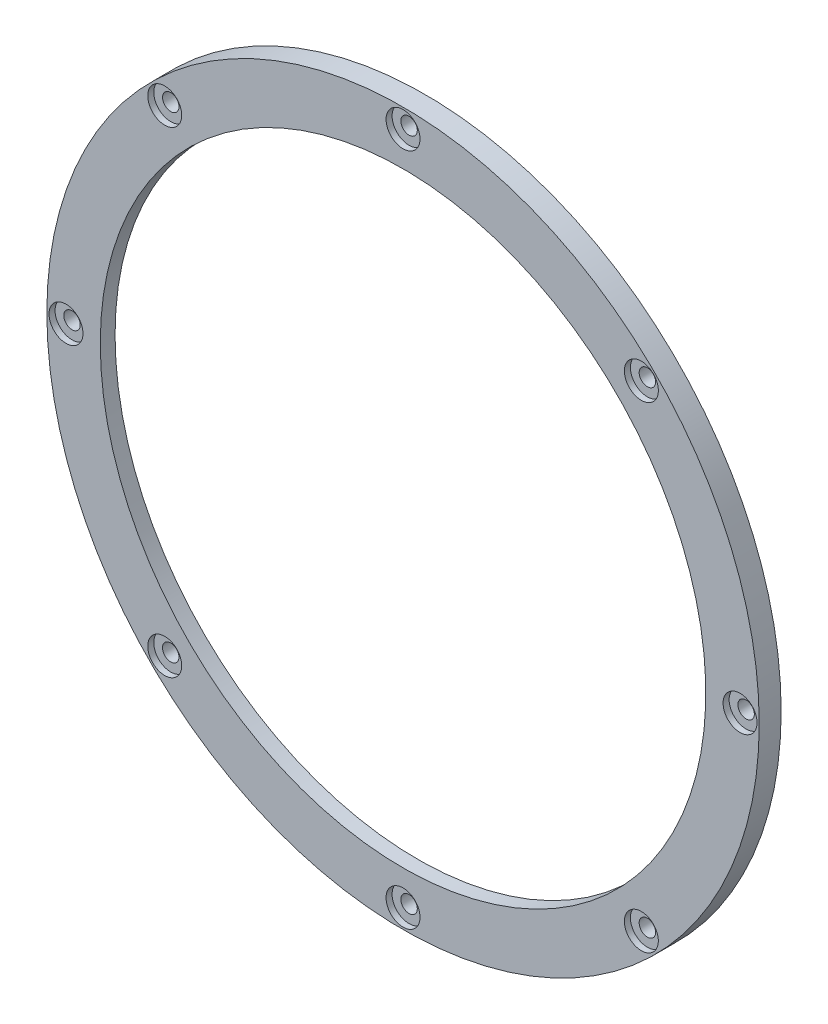
ISO-10303-21;
HEADER;
FILE_DESCRIPTION(('STEP AP214'),'2;1');
FILE_NAME('part.step','',(''),(''),'','','');
FILE_SCHEMA(('AUTOMOTIVE_DESIGN { 1 0 10303 214 1 1 1 1 }'));
ENDSEC;
DATA;
#1=APPLICATION_CONTEXT('core data for automotive mechanical design processes');
#2=APPLICATION_PROTOCOL_DEFINITION('international standard','automotive_design',2000,#1);
#3=PRODUCT_CONTEXT('',#1,'mechanical');
#4=PRODUCT('Part','Part','',(#3));
#5=PRODUCT_RELATED_PRODUCT_CATEGORY('part','',(#4));
#6=PRODUCT_DEFINITION_FORMATION('','',#4);
#7=PRODUCT_DEFINITION_CONTEXT('part definition',#1,'design');
#8=PRODUCT_DEFINITION('design','',#6,#7);
#9=PRODUCT_DEFINITION_SHAPE('','',#8);
#10=(LENGTH_UNIT() NAMED_UNIT(*) SI_UNIT(.MILLI.,.METRE.));
#11=(NAMED_UNIT(*) PLANE_ANGLE_UNIT() SI_UNIT($,.RADIAN.));
#12=(NAMED_UNIT(*) SI_UNIT($,.STERADIAN.) SOLID_ANGLE_UNIT());
#13=UNCERTAINTY_MEASURE_WITH_UNIT(LENGTH_MEASURE(1.E-05),#10,'distance_accuracy_value','');
#14=(GEOMETRIC_REPRESENTATION_CONTEXT(3) GLOBAL_UNCERTAINTY_ASSIGNED_CONTEXT((#13)) GLOBAL_UNIT_ASSIGNED_CONTEXT((#10,
#11,#12)) REPRESENTATION_CONTEXT('',''));
#15=CARTESIAN_POINT('',(0.,0.,0.));
#16=DIRECTION('',(0.,0.,1.));
#17=DIRECTION('',(1.,0.,0.));
#18=AXIS2_PLACEMENT_3D('',#15,#16,#17);
#19=CARTESIAN_POINT('',(61.5,2.14726102338853E-13,-1.3));
#20=DIRECTION('',(0.,0.,1.));
#21=DIRECTION('',(1.,0.,0.));
#22=AXIS2_PLACEMENT_3D('',#19,#20,#21);
#23=CYLINDRICAL_SURFACE('',#22,1.5);
#24=CARTESIAN_POINT('',(61.5,2.14726102338853E-13,-1.3));
#25=DIRECTION('',(0.,0.,1.));
#26=DIRECTION('',(1.,0.,0.));
#27=AXIS2_PLACEMENT_3D('',#24,#25,#26);
#28=CIRCLE('',#27,1.5);
#29=CARTESIAN_POINT('',(63.,2.14726102338853E-13,-1.3));
#30=VERTEX_POINT('',#29);
#31=EDGE_CURVE('E107',#30,#30,#28,.F.);
#32=ORIENTED_EDGE('',*,*,#31,.T.);
#33=EDGE_LOOP('',(#32));
#34=FACE_BOUND('',#33,.T.);
#35=CARTESIAN_POINT('',(61.5,2.14726102338853E-13,1.6));
#36=DIRECTION('',(0.,0.,1.));
#37=DIRECTION('',(1.,0.,0.));
#38=AXIS2_PLACEMENT_3D('',#35,#36,#37);
#39=CIRCLE('',#38,1.5);
#40=CARTESIAN_POINT('',(63.,2.14726102338853E-13,1.6));
#41=VERTEX_POINT('',#40);
#42=EDGE_CURVE('E122',#41,#41,#39,.F.);
#43=ORIENTED_EDGE('',*,*,#42,.F.);
#44=EDGE_LOOP('',(#43));
#45=FACE_BOUND('',#44,.T.);
#46=ADVANCED_FACE('F15',(#34,#45),#23,.F.);
#47=CARTESIAN_POINT('',(43.4870670429724,43.4870670429729,-1.3));
#48=DIRECTION('',(0.,0.,1.));
#49=DIRECTION('',(1.,0.,0.));
#50=AXIS2_PLACEMENT_3D('',#47,#48,#49);
#51=CYLINDRICAL_SURFACE('',#50,1.5);
#52=CARTESIAN_POINT('',(43.4870670429724,43.4870670429729,-1.3));
#53=DIRECTION('',(0.,0.,1.));
#54=DIRECTION('',(1.,0.,0.));
#55=AXIS2_PLACEMENT_3D('',#52,#53,#54);
#56=CIRCLE('',#55,1.5);
#57=CARTESIAN_POINT('',(44.9870670429724,43.4870670429729,-1.3));
#58=VERTEX_POINT('',#57);
#59=EDGE_CURVE('E104',#58,#58,#56,.F.);
#60=ORIENTED_EDGE('',*,*,#59,.T.);
#61=EDGE_LOOP('',(#60));
#62=FACE_BOUND('',#61,.T.);
#63=CARTESIAN_POINT('',(43.4870670429724,43.4870670429729,1.6));
#64=DIRECTION('',(0.,0.,1.));
#65=DIRECTION('',(1.,0.,0.));
#66=AXIS2_PLACEMENT_3D('',#63,#64,#65);
#67=CIRCLE('',#66,1.5);
#68=CARTESIAN_POINT('',(44.9870670429724,43.4870670429729,1.6));
#69=VERTEX_POINT('',#68);
#70=EDGE_CURVE('E119',#69,#69,#67,.F.);
#71=ORIENTED_EDGE('',*,*,#70,.F.);
#72=EDGE_LOOP('',(#71));
#73=FACE_BOUND('',#72,.T.);
#74=ADVANCED_FACE('F153',(#62,#73),#51,.F.);
#75=CARTESIAN_POINT('',(-43.4870670429731,43.4870670429723,-1.3));
#76=DIRECTION('',(0.,0.,1.));
#77=DIRECTION('',(1.,0.,0.));
#78=AXIS2_PLACEMENT_3D('',#75,#76,#77);
#79=CYLINDRICAL_SURFACE('',#78,1.5);
#80=CARTESIAN_POINT('',(-43.4870670429731,43.4870670429723,-1.3));
#81=DIRECTION('',(0.,0.,1.));
#82=DIRECTION('',(1.,0.,0.));
#83=AXIS2_PLACEMENT_3D('',#80,#81,#82);
#84=CIRCLE('',#83,1.5);
#85=CARTESIAN_POINT('',(-41.9870670429731,43.4870670429723,-1.3));
#86=VERTEX_POINT('',#85);
#87=EDGE_CURVE('E101',#86,#86,#84,.F.);
#88=ORIENTED_EDGE('',*,*,#87,.T.);
#89=EDGE_LOOP('',(#88));
#90=FACE_BOUND('',#89,.T.);
#91=CARTESIAN_POINT('',(-43.4870670429731,43.4870670429723,1.6));
#92=DIRECTION('',(0.,0.,1.));
#93=DIRECTION('',(1.,0.,0.));
#94=AXIS2_PLACEMENT_3D('',#91,#92,#93);
#95=CIRCLE('',#94,1.5);
#96=CARTESIAN_POINT('',(-41.9870670429731,43.4870670429723,1.6));
#97=VERTEX_POINT('',#96);
#98=EDGE_CURVE('E116',#97,#97,#95,.F.);
#99=ORIENTED_EDGE('',*,*,#98,.F.);
#100=EDGE_LOOP('',(#99));
#101=FACE_BOUND('',#100,.T.);
#102=ADVANCED_FACE('F142',(#90,#101),#79,.F.);
#103=CARTESIAN_POINT('',(-61.5,-6.44178307016558E-13,-1.3));
#104=DIRECTION('',(0.,0.,1.));
#105=DIRECTION('',(1.,0.,0.));
#106=AXIS2_PLACEMENT_3D('',#103,#104,#105);
#107=CYLINDRICAL_SURFACE('',#106,1.5);
#108=CARTESIAN_POINT('',(-61.5,-6.44178307016558E-13,-1.3));
#109=DIRECTION('',(0.,0.,1.));
#110=DIRECTION('',(1.,0.,0.));
#111=AXIS2_PLACEMENT_3D('',#108,#109,#110);
#112=CIRCLE('',#111,1.5);
#113=CARTESIAN_POINT('',(-60.,-6.44178307016558E-13,-1.3));
#114=VERTEX_POINT('',#113);
#115=EDGE_CURVE('E98',#114,#114,#112,.F.);
#116=ORIENTED_EDGE('',*,*,#115,.T.);
#117=EDGE_LOOP('',(#116));
#118=FACE_BOUND('',#117,.T.);
#119=CARTESIAN_POINT('',(-61.5,-6.44178307016558E-13,1.6));
#120=DIRECTION('',(0.,0.,1.));
#121=DIRECTION('',(1.,0.,0.));
#122=AXIS2_PLACEMENT_3D('',#119,#120,#121);
#123=CIRCLE('',#122,1.5);
#124=CARTESIAN_POINT('',(-60.,-6.44178307016558E-13,1.6));
#125=VERTEX_POINT('',#124);
#126=EDGE_CURVE('E18',#125,#125,#123,.F.);
#127=ORIENTED_EDGE('',*,*,#126,.F.);
#128=EDGE_LOOP('',(#127));
#129=FACE_BOUND('',#128,.T.);
#130=ADVANCED_FACE('F139',(#118,#129),#107,.F.);
#131=CARTESIAN_POINT('',(-43.4870670429721,-43.4870670429732,-1.3));
#132=DIRECTION('',(0.,0.,1.));
#133=DIRECTION('',(1.,0.,0.));
#134=AXIS2_PLACEMENT_3D('',#131,#132,#133);
#135=CYLINDRICAL_SURFACE('',#134,1.5);
#136=CARTESIAN_POINT('',(-43.4870670429721,-43.4870670429732,-1.3));
#137=DIRECTION('',(0.,0.,1.));
#138=DIRECTION('',(1.,0.,0.));
#139=AXIS2_PLACEMENT_3D('',#136,#137,#138);
#140=CIRCLE('',#139,1.5);
#141=CARTESIAN_POINT('',(-41.9870670429721,-43.4870670429732,-1.3));
#142=VERTEX_POINT('',#141);
#143=EDGE_CURVE('E95',#142,#142,#140,.F.);
#144=ORIENTED_EDGE('',*,*,#143,.T.);
#145=EDGE_LOOP('',(#144));
#146=FACE_BOUND('',#145,.T.);
#147=CARTESIAN_POINT('',(-43.4870670429721,-43.4870670429732,1.6));
#148=DIRECTION('',(0.,0.,1.));
#149=DIRECTION('',(1.,0.,0.));
#150=AXIS2_PLACEMENT_3D('',#147,#148,#149);
#151=CIRCLE('',#150,1.5);
#152=CARTESIAN_POINT('',(-41.9870670429721,-43.4870670429732,1.6));
#153=VERTEX_POINT('',#152);
#154=EDGE_CURVE('E130',#153,#153,#151,.F.);
#155=ORIENTED_EDGE('',*,*,#154,.F.);
#156=EDGE_LOOP('',(#155));
#157=FACE_BOUND('',#156,.T.);
#158=ADVANCED_FACE('F141',(#146,#157),#135,.F.);
#159=CARTESIAN_POINT('',(43.4870670429727,-43.4870670429726,-1.3));
#160=DIRECTION('',(0.,0.,1.));
#161=DIRECTION('',(1.,0.,0.));
#162=AXIS2_PLACEMENT_3D('',#159,#160,#161);
#163=CYLINDRICAL_SURFACE('',#162,1.5);
#164=CARTESIAN_POINT('',(43.4870670429727,-43.4870670429726,-1.3));
#165=DIRECTION('',(0.,0.,1.));
#166=DIRECTION('',(1.,0.,0.));
#167=AXIS2_PLACEMENT_3D('',#164,#165,#166);
#168=CIRCLE('',#167,1.5);
#169=CARTESIAN_POINT('',(44.9870670429727,-43.4870670429726,-1.3));
#170=VERTEX_POINT('',#169);
#171=EDGE_CURVE('E92',#170,#170,#168,.F.);
#172=ORIENTED_EDGE('',*,*,#171,.T.);
#173=EDGE_LOOP('',(#172));
#174=FACE_BOUND('',#173,.T.);
#175=CARTESIAN_POINT('',(43.4870670429727,-43.4870670429726,1.6));
#176=DIRECTION('',(0.,0.,1.));
#177=DIRECTION('',(1.,0.,0.));
#178=AXIS2_PLACEMENT_3D('',#175,#176,#177);
#179=CIRCLE('',#178,1.5);
#180=CARTESIAN_POINT('',(44.9870670429727,-43.4870670429726,1.6));
#181=VERTEX_POINT('',#180);
#182=EDGE_CURVE('E125',#181,#181,#179,.F.);
#183=ORIENTED_EDGE('',*,*,#182,.F.);
#184=EDGE_LOOP('',(#183));
#185=FACE_BOUND('',#184,.T.);
#186=ADVANCED_FACE('F150',(#174,#185),#163,.F.);
#187=CARTESIAN_POINT('',(0.,-61.5,-1.3));
#188=DIRECTION('',(0.,0.,1.));
#189=DIRECTION('',(1.,0.,0.));
#190=AXIS2_PLACEMENT_3D('',#187,#188,#189);
#191=CYLINDRICAL_SURFACE('',#190,1.5);
#192=CARTESIAN_POINT('',(0.,-61.5,-1.3));
#193=DIRECTION('',(0.,0.,1.));
#194=DIRECTION('',(1.,0.,0.));
#195=AXIS2_PLACEMENT_3D('',#192,#193,#194);
#196=CIRCLE('',#195,1.5);
#197=CARTESIAN_POINT('',(1.5,-61.5,-1.3));
#198=VERTEX_POINT('',#197);
#199=EDGE_CURVE('E89',#198,#198,#196,.F.);
#200=ORIENTED_EDGE('',*,*,#199,.T.);
#201=EDGE_LOOP('',(#200));
#202=FACE_BOUND('',#201,.T.);
#203=CARTESIAN_POINT('',(0.,-61.5,1.6));
#204=DIRECTION('',(0.,0.,1.));
#205=DIRECTION('',(1.,0.,0.));
#206=AXIS2_PLACEMENT_3D('',#203,#204,#205);
#207=CIRCLE('',#206,1.5);
#208=CARTESIAN_POINT('',(1.5,-61.5,1.6));
#209=VERTEX_POINT('',#208);
#210=EDGE_CURVE('E128',#209,#209,#207,.F.);
#211=ORIENTED_EDGE('',*,*,#210,.F.);
#212=EDGE_LOOP('',(#211));
#213=FACE_BOUND('',#212,.T.);
#214=ADVANCED_FACE('F249',(#202,#213),#191,.F.);
#215=CARTESIAN_POINT('',(0.,61.5,-1.3));
#216=DIRECTION('',(0.,0.,1.));
#217=DIRECTION('',(1.,0.,0.));
#218=AXIS2_PLACEMENT_3D('',#215,#216,#217);
#219=CYLINDRICAL_SURFACE('',#218,1.5);
#220=CARTESIAN_POINT('',(0.,61.5,-1.3));
#221=DIRECTION('',(0.,0.,1.));
#222=DIRECTION('',(1.,0.,0.));
#223=AXIS2_PLACEMENT_3D('',#220,#221,#222);
#224=CIRCLE('',#223,1.5);
#225=CARTESIAN_POINT('',(1.5,61.5,-1.3));
#226=VERTEX_POINT('',#225);
#227=EDGE_CURVE('E86',#226,#226,#224,.F.);
#228=ORIENTED_EDGE('',*,*,#227,.T.);
#229=EDGE_LOOP('',(#228));
#230=FACE_BOUND('',#229,.T.);
#231=CARTESIAN_POINT('',(0.,61.5,1.6));
#232=DIRECTION('',(0.,0.,1.));
#233=DIRECTION('',(1.,0.,0.));
#234=AXIS2_PLACEMENT_3D('',#231,#232,#233);
#235=CIRCLE('',#234,1.5);
#236=CARTESIAN_POINT('',(1.5,61.5,1.6));
#237=VERTEX_POINT('',#236);
#238=EDGE_CURVE('E113',#237,#237,#235,.F.);
#239=ORIENTED_EDGE('',*,*,#238,.F.);
#240=EDGE_LOOP('',(#239));
#241=FACE_BOUND('',#240,.T.);
#242=ADVANCED_FACE('F245',(#230,#241),#219,.F.);
#243=CARTESIAN_POINT('',(0.,0.,-1.3));
#244=DIRECTION('',(0.,0.,1.));
#245=DIRECTION('',(1.,0.,0.));
#246=AXIS2_PLACEMENT_3D('',#243,#244,#245);
#247=CYLINDRICAL_SURFACE('',#246,58.75);
#248=CARTESIAN_POINT('',(0.,0.,-1.3));
#249=DIRECTION('',(0.,0.,1.));
#250=DIRECTION('',(1.,0.,0.));
#251=AXIS2_PLACEMENT_3D('',#248,#249,#250);
#252=CIRCLE('',#251,58.75);
#253=CARTESIAN_POINT('',(58.75,0.,-1.3));
#254=VERTEX_POINT('',#253);
#255=EDGE_CURVE('E83',#254,#254,#252,.F.);
#256=ORIENTED_EDGE('',*,*,#255,.T.);
#257=EDGE_LOOP('',(#256));
#258=FACE_BOUND('',#257,.T.);
#259=CARTESIAN_POINT('',(0.,0.,0.));
#260=DIRECTION('',(0.,0.,1.));
#261=DIRECTION('',(1.,0.,0.));
#262=AXIS2_PLACEMENT_3D('',#259,#260,#261);
#263=CIRCLE('',#262,58.75);
#264=CARTESIAN_POINT('',(58.75,0.,0.));
#265=VERTEX_POINT('',#264);
#266=EDGE_CURVE('E110',#265,#265,#263,.T.);
#267=ORIENTED_EDGE('',*,*,#266,.T.);
#268=EDGE_LOOP('',(#267));
#269=FACE_BOUND('',#268,.T.);
#270=ADVANCED_FACE('F241',(#258,#269),#247,.F.);
#271=CARTESIAN_POINT('',(-61.5,-2.14726102338853E-13,1.6));
#272=DIRECTION('',(0.,0.,1.));
#273=DIRECTION('',(1.,0.,0.));
#274=AXIS2_PLACEMENT_3D('',#271,#272,#273);
#275=PLANE('',#274);
#276=CARTESIAN_POINT('',(-61.5,-2.14726102338853E-13,1.6));
#277=DIRECTION('',(0.,0.,1.));
#278=DIRECTION('',(1.,0.,0.));
#279=AXIS2_PLACEMENT_3D('',#276,#277,#278);
#280=CIRCLE('',#279,3.1);
#281=CARTESIAN_POINT('',(-58.4,-2.14726102338853E-13,1.6));
#282=VERTEX_POINT('',#281);
#283=EDGE_CURVE('E80',#282,#282,#280,.T.);
#284=ORIENTED_EDGE('',*,*,#283,.T.);
#285=EDGE_LOOP('',(#284));
#286=FACE_BOUND('',#285,.T.);
#287=ORIENTED_EDGE('',*,*,#126,.T.);
#288=EDGE_LOOP('',(#287));
#289=FACE_BOUND('',#288,.T.);
#290=ADVANCED_FACE('F137',(#286,#289),#275,.T.);
#291=CARTESIAN_POINT('',(-43.4870670429724,-43.4870670429729,1.6));
#292=DIRECTION('',(0.,0.,1.));
#293=DIRECTION('',(1.,0.,0.));
#294=AXIS2_PLACEMENT_3D('',#291,#292,#293);
#295=PLANE('',#294);
#296=CARTESIAN_POINT('',(-43.4870670429724,-43.4870670429729,1.6));
#297=DIRECTION('',(0.,0.,1.));
#298=DIRECTION('',(1.,0.,0.));
#299=AXIS2_PLACEMENT_3D('',#296,#297,#298);
#300=CIRCLE('',#299,3.1);
#301=CARTESIAN_POINT('',(-40.3870670429724,-43.4870670429729,1.6));
#302=VERTEX_POINT('',#301);
#303=EDGE_CURVE('E77',#302,#302,#300,.T.);
#304=ORIENTED_EDGE('',*,*,#303,.T.);
#305=EDGE_LOOP('',(#304));
#306=FACE_BOUND('',#305,.T.);
#307=ORIENTED_EDGE('',*,*,#154,.T.);
#308=EDGE_LOOP('',(#307));
#309=FACE_BOUND('',#308,.T.);
#310=ADVANCED_FACE('F234',(#306,#309),#295,.T.);
#311=CARTESIAN_POINT('',(0.,-61.5,1.6));
#312=DIRECTION('',(0.,0.,1.));
#313=DIRECTION('',(1.,0.,0.));
#314=AXIS2_PLACEMENT_3D('',#311,#312,#313);
#315=PLANE('',#314);
#316=CARTESIAN_POINT('',(0.,-61.5,1.6));
#317=DIRECTION('',(0.,0.,1.));
#318=DIRECTION('',(1.,0.,0.));
#319=AXIS2_PLACEMENT_3D('',#316,#317,#318);
#320=CIRCLE('',#319,3.1);
#321=CARTESIAN_POINT('',(3.1,-61.5,1.6));
#322=VERTEX_POINT('',#321);
#323=EDGE_CURVE('E74',#322,#322,#320,.T.);
#324=ORIENTED_EDGE('',*,*,#323,.T.);
#325=EDGE_LOOP('',(#324));
#326=FACE_BOUND('',#325,.T.);
#327=ORIENTED_EDGE('',*,*,#210,.T.);
#328=EDGE_LOOP('',(#327));
#329=FACE_BOUND('',#328,.T.);
#330=ADVANCED_FACE('F230',(#326,#329),#315,.T.);
#331=CARTESIAN_POINT('',(43.4870670429731,-43.4870670429723,1.6));
#332=DIRECTION('',(0.,0.,1.));
#333=DIRECTION('',(1.,0.,0.));
#334=AXIS2_PLACEMENT_3D('',#331,#332,#333);
#335=PLANE('',#334);
#336=CARTESIAN_POINT('',(43.4870670429731,-43.4870670429723,1.6));
#337=DIRECTION('',(0.,0.,1.));
#338=DIRECTION('',(1.,0.,0.));
#339=AXIS2_PLACEMENT_3D('',#336,#337,#338);
#340=CIRCLE('',#339,3.1);
#341=CARTESIAN_POINT('',(46.5870670429731,-43.4870670429723,1.6));
#342=VERTEX_POINT('',#341);
#343=EDGE_CURVE('E71',#342,#342,#340,.T.);
#344=ORIENTED_EDGE('',*,*,#343,.T.);
#345=EDGE_LOOP('',(#344));
#346=FACE_BOUND('',#345,.T.);
#347=ORIENTED_EDGE('',*,*,#182,.T.);
#348=EDGE_LOOP('',(#347));
#349=FACE_BOUND('',#348,.T.);
#350=ADVANCED_FACE('F226',(#346,#349),#335,.T.);
#351=CARTESIAN_POINT('',(61.5,6.44178307016558E-13,1.6));
#352=DIRECTION('',(0.,0.,1.));
#353=DIRECTION('',(1.,0.,0.));
#354=AXIS2_PLACEMENT_3D('',#351,#352,#353);
#355=PLANE('',#354);
#356=CARTESIAN_POINT('',(61.5,6.44178307016558E-13,1.6));
#357=DIRECTION('',(0.,0.,1.));
#358=DIRECTION('',(1.,0.,0.));
#359=AXIS2_PLACEMENT_3D('',#356,#357,#358);
#360=CIRCLE('',#359,3.10000000000001);
#361=CARTESIAN_POINT('',(64.6,6.44178307016558E-13,1.6));
#362=VERTEX_POINT('',#361);
#363=EDGE_CURVE('E68',#362,#362,#360,.T.);
#364=ORIENTED_EDGE('',*,*,#363,.T.);
#365=EDGE_LOOP('',(#364));
#366=FACE_BOUND('',#365,.T.);
#367=ORIENTED_EDGE('',*,*,#42,.T.);
#368=EDGE_LOOP('',(#367));
#369=FACE_BOUND('',#368,.T.);
#370=ADVANCED_FACE('F222',(#366,#369),#355,.T.);
#371=CARTESIAN_POINT('',(43.4870670429721,43.4870670429732,1.6));
#372=DIRECTION('',(0.,0.,1.));
#373=DIRECTION('',(1.,0.,0.));
#374=AXIS2_PLACEMENT_3D('',#371,#372,#373);
#375=PLANE('',#374);
#376=CARTESIAN_POINT('',(43.4870670429721,43.4870670429732,1.6));
#377=DIRECTION('',(0.,0.,1.));
#378=DIRECTION('',(1.,0.,0.));
#379=AXIS2_PLACEMENT_3D('',#376,#377,#378);
#380=CIRCLE('',#379,3.1);
#381=CARTESIAN_POINT('',(46.5870670429721,43.4870670429732,1.6));
#382=VERTEX_POINT('',#381);
#383=EDGE_CURVE('E65',#382,#382,#380,.T.);
#384=ORIENTED_EDGE('',*,*,#383,.T.);
#385=EDGE_LOOP('',(#384));
#386=FACE_BOUND('',#385,.T.);
#387=ORIENTED_EDGE('',*,*,#70,.T.);
#388=EDGE_LOOP('',(#387));
#389=FACE_BOUND('',#388,.T.);
#390=ADVANCED_FACE('F218',(#386,#389),#375,.T.);
#391=CARTESIAN_POINT('',(-43.4870670429727,43.4870670429726,1.6));
#392=DIRECTION('',(0.,0.,1.));
#393=DIRECTION('',(1.,0.,0.));
#394=AXIS2_PLACEMENT_3D('',#391,#392,#393);
#395=PLANE('',#394);
#396=CARTESIAN_POINT('',(-43.4870670429727,43.4870670429726,1.6));
#397=DIRECTION('',(0.,0.,1.));
#398=DIRECTION('',(1.,0.,0.));
#399=AXIS2_PLACEMENT_3D('',#396,#397,#398);
#400=CIRCLE('',#399,3.1);
#401=CARTESIAN_POINT('',(-40.3870670429728,43.4870670429726,1.6));
#402=VERTEX_POINT('',#401);
#403=EDGE_CURVE('E62',#402,#402,#400,.T.);
#404=ORIENTED_EDGE('',*,*,#403,.T.);
#405=EDGE_LOOP('',(#404));
#406=FACE_BOUND('',#405,.T.);
#407=ORIENTED_EDGE('',*,*,#98,.T.);
#408=EDGE_LOOP('',(#407));
#409=FACE_BOUND('',#408,.T.);
#410=ADVANCED_FACE('F214',(#406,#409),#395,.T.);
#411=CARTESIAN_POINT('',(0.,61.5,1.6));
#412=DIRECTION('',(0.,0.,1.));
#413=DIRECTION('',(1.,0.,0.));
#414=AXIS2_PLACEMENT_3D('',#411,#412,#413);
#415=PLANE('',#414);
#416=ORIENTED_EDGE('',*,*,#238,.T.);
#417=EDGE_LOOP('',(#416));
#418=FACE_BOUND('',#417,.T.);
#419=CARTESIAN_POINT('',(0.,61.5,1.6));
#420=DIRECTION('',(0.,0.,1.));
#421=DIRECTION('',(1.,0.,0.));
#422=AXIS2_PLACEMENT_3D('',#419,#420,#421);
#423=CIRCLE('',#422,3.1);
#424=CARTESIAN_POINT('',(3.1,61.5,1.6));
#425=VERTEX_POINT('',#424);
#426=EDGE_CURVE('E59',#425,#425,#423,.T.);
#427=ORIENTED_EDGE('',*,*,#426,.T.);
#428=EDGE_LOOP('',(#427));
#429=FACE_BOUND('',#428,.T.);
#430=ADVANCED_FACE('F210',(#418,#429),#415,.T.);
#431=CARTESIAN_POINT('',(0.,0.,0.));
#432=DIRECTION('',(0.,0.,1.));
#433=DIRECTION('',(1.,0.,0.));
#434=AXIS2_PLACEMENT_3D('',#431,#432,#433);
#435=PLANE('',#434);
#436=CARTESIAN_POINT('',(0.,0.,0.));
#437=DIRECTION('',(0.,0.,-1.));
#438=DIRECTION('',(-1.,0.,0.));
#439=AXIS2_PLACEMENT_3D('',#436,#437,#438);
#440=CIRCLE('',#439,55.25);
#441=CARTESIAN_POINT('',(-55.25,0.,0.));
#442=VERTEX_POINT('',#441);
#443=EDGE_CURVE('E56',#442,#442,#440,.F.);
#444=ORIENTED_EDGE('',*,*,#443,.T.);
#445=EDGE_LOOP('',(#444));
#446=FACE_BOUND('',#445,.T.);
#447=ORIENTED_EDGE('',*,*,#266,.F.);
#448=EDGE_LOOP('',(#447));
#449=FACE_BOUND('',#448,.T.);
#450=ADVANCED_FACE('F206',(#446,#449),#435,.F.);
#451=CARTESIAN_POINT('',(0.,0.,-1.3));
#452=DIRECTION('',(0.,0.,1.));
#453=DIRECTION('',(1.,0.,0.));
#454=AXIS2_PLACEMENT_3D('',#451,#452,#453);
#455=PLANE('',#454);
#456=CARTESIAN_POINT('',(0.,0.,-1.3));
#457=DIRECTION('',(0.,0.,1.));
#458=DIRECTION('',(1.,0.,0.));
#459=AXIS2_PLACEMENT_3D('',#456,#457,#458);
#460=CIRCLE('',#459,65.);
#461=CARTESIAN_POINT('',(65.,0.,-1.3));
#462=VERTEX_POINT('',#461);
#463=EDGE_CURVE('E53',#462,#462,#460,.T.);
#464=ORIENTED_EDGE('',*,*,#463,.F.);
#465=EDGE_LOOP('',(#464));
#466=FACE_BOUND('',#465,.T.);
#467=ORIENTED_EDGE('',*,*,#255,.F.);
#468=EDGE_LOOP('',(#467));
#469=FACE_BOUND('',#468,.T.);
#470=ORIENTED_EDGE('',*,*,#227,.F.);
#471=EDGE_LOOP('',(#470));
#472=FACE_BOUND('',#471,.T.);
#473=ORIENTED_EDGE('',*,*,#199,.F.);
#474=EDGE_LOOP('',(#473));
#475=FACE_BOUND('',#474,.T.);
#476=ORIENTED_EDGE('',*,*,#171,.F.);
#477=EDGE_LOOP('',(#476));
#478=FACE_BOUND('',#477,.T.);
#479=ORIENTED_EDGE('',*,*,#143,.F.);
#480=EDGE_LOOP('',(#479));
#481=FACE_BOUND('',#480,.T.);
#482=ORIENTED_EDGE('',*,*,#115,.F.);
#483=EDGE_LOOP('',(#482));
#484=FACE_BOUND('',#483,.T.);
#485=ORIENTED_EDGE('',*,*,#87,.F.);
#486=EDGE_LOOP('',(#485));
#487=FACE_BOUND('',#486,.T.);
#488=ORIENTED_EDGE('',*,*,#59,.F.);
#489=EDGE_LOOP('',(#488));
#490=FACE_BOUND('',#489,.T.);
#491=ORIENTED_EDGE('',*,*,#31,.F.);
#492=EDGE_LOOP('',(#491));
#493=FACE_BOUND('',#492,.T.);
#494=ADVANCED_FACE('F202',(#466,#469,#472,#475,#478,#481,#484,#487,#490,#493),#455,.F.);
#495=CARTESIAN_POINT('',(-61.5,-2.14726102338853E-13,1.6));
#496=DIRECTION('',(0.,0.,1.));
#497=DIRECTION('',(1.,0.,0.));
#498=AXIS2_PLACEMENT_3D('',#495,#496,#497);
#499=CYLINDRICAL_SURFACE('',#498,3.1);
#500=CARTESIAN_POINT('',(-61.5,-2.14726102338853E-13,2.7));
#501=DIRECTION('',(0.,0.,1.));
#502=DIRECTION('',(1.,0.,0.));
#503=AXIS2_PLACEMENT_3D('',#500,#501,#502);
#504=CIRCLE('',#503,3.1);
#505=CARTESIAN_POINT('',(-58.4,-2.14726102338853E-13,2.7));
#506=VERTEX_POINT('',#505);
#507=EDGE_CURVE('E50',#506,#506,#504,.F.);
#508=ORIENTED_EDGE('',*,*,#507,.F.);
#509=EDGE_LOOP('',(#508));
#510=FACE_BOUND('',#509,.T.);
#511=ORIENTED_EDGE('',*,*,#283,.F.);
#512=EDGE_LOOP('',(#511));
#513=FACE_BOUND('',#512,.T.);
#514=ADVANCED_FACE('F198',(#510,#513),#499,.F.);
#515=CARTESIAN_POINT('',(-43.4870670429724,-43.4870670429729,1.6));
#516=DIRECTION('',(0.,0.,1.));
#517=DIRECTION('',(1.,0.,0.));
#518=AXIS2_PLACEMENT_3D('',#515,#516,#517);
#519=CYLINDRICAL_SURFACE('',#518,3.1);
#520=CARTESIAN_POINT('',(-43.4870670429724,-43.4870670429729,2.7));
#521=DIRECTION('',(0.,0.,1.));
#522=DIRECTION('',(1.,0.,0.));
#523=AXIS2_PLACEMENT_3D('',#520,#521,#522);
#524=CIRCLE('',#523,3.1);
#525=CARTESIAN_POINT('',(-40.3870670429724,-43.4870670429729,2.7));
#526=VERTEX_POINT('',#525);
#527=EDGE_CURVE('E47',#526,#526,#524,.F.);
#528=ORIENTED_EDGE('',*,*,#527,.F.);
#529=EDGE_LOOP('',(#528));
#530=FACE_BOUND('',#529,.T.);
#531=ORIENTED_EDGE('',*,*,#303,.F.);
#532=EDGE_LOOP('',(#531));
#533=FACE_BOUND('',#532,.T.);
#534=ADVANCED_FACE('F194',(#530,#533),#519,.F.);
#535=CARTESIAN_POINT('',(0.,-61.5,1.6));
#536=DIRECTION('',(0.,0.,1.));
#537=DIRECTION('',(1.,0.,0.));
#538=AXIS2_PLACEMENT_3D('',#535,#536,#537);
#539=CYLINDRICAL_SURFACE('',#538,3.1);
#540=CARTESIAN_POINT('',(0.,-61.5,2.7));
#541=DIRECTION('',(0.,0.,1.));
#542=DIRECTION('',(1.,0.,0.));
#543=AXIS2_PLACEMENT_3D('',#540,#541,#542);
#544=CIRCLE('',#543,3.1);
#545=CARTESIAN_POINT('',(3.1,-61.5,2.7));
#546=VERTEX_POINT('',#545);
#547=EDGE_CURVE('E44',#546,#546,#544,.F.);
#548=ORIENTED_EDGE('',*,*,#547,.F.);
#549=EDGE_LOOP('',(#548));
#550=FACE_BOUND('',#549,.T.);
#551=ORIENTED_EDGE('',*,*,#323,.F.);
#552=EDGE_LOOP('',(#551));
#553=FACE_BOUND('',#552,.T.);
#554=ADVANCED_FACE('F190',(#550,#553),#539,.F.);
#555=CARTESIAN_POINT('',(43.4870670429731,-43.4870670429723,1.6));
#556=DIRECTION('',(0.,0.,1.));
#557=DIRECTION('',(1.,0.,0.));
#558=AXIS2_PLACEMENT_3D('',#555,#556,#557);
#559=CYLINDRICAL_SURFACE('',#558,3.1);
#560=CARTESIAN_POINT('',(43.4870670429731,-43.4870670429723,2.7));
#561=DIRECTION('',(0.,0.,1.));
#562=DIRECTION('',(1.,0.,0.));
#563=AXIS2_PLACEMENT_3D('',#560,#561,#562);
#564=CIRCLE('',#563,3.1);
#565=CARTESIAN_POINT('',(46.5870670429731,-43.4870670429723,2.7));
#566=VERTEX_POINT('',#565);
#567=EDGE_CURVE('E41',#566,#566,#564,.F.);
#568=ORIENTED_EDGE('',*,*,#567,.F.);
#569=EDGE_LOOP('',(#568));
#570=FACE_BOUND('',#569,.T.);
#571=ORIENTED_EDGE('',*,*,#343,.F.);
#572=EDGE_LOOP('',(#571));
#573=FACE_BOUND('',#572,.T.);
#574=ADVANCED_FACE('F186',(#570,#573),#559,.F.);
#575=CARTESIAN_POINT('',(61.5,6.44178307016558E-13,1.6));
#576=DIRECTION('',(0.,0.,1.));
#577=DIRECTION('',(1.,0.,0.));
#578=AXIS2_PLACEMENT_3D('',#575,#576,#577);
#579=CYLINDRICAL_SURFACE('',#578,3.10000000000001);
#580=CARTESIAN_POINT('',(61.5,6.44178307016558E-13,2.7));
#581=DIRECTION('',(0.,0.,1.));
#582=DIRECTION('',(1.,0.,0.));
#583=AXIS2_PLACEMENT_3D('',#580,#581,#582);
#584=CIRCLE('',#583,3.10000000000001);
#585=CARTESIAN_POINT('',(64.6,6.44178307016558E-13,2.7));
#586=VERTEX_POINT('',#585);
#587=EDGE_CURVE('E38',#586,#586,#584,.F.);
#588=ORIENTED_EDGE('',*,*,#587,.F.);
#589=EDGE_LOOP('',(#588));
#590=FACE_BOUND('',#589,.T.);
#591=ORIENTED_EDGE('',*,*,#363,.F.);
#592=EDGE_LOOP('',(#591));
#593=FACE_BOUND('',#592,.T.);
#594=ADVANCED_FACE('F182',(#590,#593),#579,.F.);
#595=CARTESIAN_POINT('',(43.4870670429721,43.4870670429732,1.6));
#596=DIRECTION('',(0.,0.,1.));
#597=DIRECTION('',(1.,0.,0.));
#598=AXIS2_PLACEMENT_3D('',#595,#596,#597);
#599=CYLINDRICAL_SURFACE('',#598,3.1);
#600=CARTESIAN_POINT('',(43.4870670429721,43.4870670429732,2.7));
#601=DIRECTION('',(0.,0.,1.));
#602=DIRECTION('',(1.,0.,0.));
#603=AXIS2_PLACEMENT_3D('',#600,#601,#602);
#604=CIRCLE('',#603,3.1);
#605=CARTESIAN_POINT('',(46.5870670429721,43.4870670429732,2.7));
#606=VERTEX_POINT('',#605);
#607=EDGE_CURVE('E35',#606,#606,#604,.F.);
#608=ORIENTED_EDGE('',*,*,#607,.F.);
#609=EDGE_LOOP('',(#608));
#610=FACE_BOUND('',#609,.T.);
#611=ORIENTED_EDGE('',*,*,#383,.F.);
#612=EDGE_LOOP('',(#611));
#613=FACE_BOUND('',#612,.T.);
#614=ADVANCED_FACE('F178',(#610,#613),#599,.F.);
#615=CARTESIAN_POINT('',(-43.4870670429727,43.4870670429726,1.6));
#616=DIRECTION('',(0.,0.,1.));
#617=DIRECTION('',(1.,0.,0.));
#618=AXIS2_PLACEMENT_3D('',#615,#616,#617);
#619=CYLINDRICAL_SURFACE('',#618,3.1);
#620=CARTESIAN_POINT('',(-43.4870670429727,43.4870670429726,2.7));
#621=DIRECTION('',(0.,0.,1.));
#622=DIRECTION('',(1.,0.,0.));
#623=AXIS2_PLACEMENT_3D('',#620,#621,#622);
#624=CIRCLE('',#623,3.1);
#625=CARTESIAN_POINT('',(-40.3870670429728,43.4870670429726,2.7));
#626=VERTEX_POINT('',#625);
#627=EDGE_CURVE('E32',#626,#626,#624,.F.);
#628=ORIENTED_EDGE('',*,*,#627,.F.);
#629=EDGE_LOOP('',(#628));
#630=FACE_BOUND('',#629,.T.);
#631=ORIENTED_EDGE('',*,*,#403,.F.);
#632=EDGE_LOOP('',(#631));
#633=FACE_BOUND('',#632,.T.);
#634=ADVANCED_FACE('F174',(#630,#633),#619,.F.);
#635=CARTESIAN_POINT('',(0.,61.5,1.6));
#636=DIRECTION('',(0.,0.,1.));
#637=DIRECTION('',(1.,0.,0.));
#638=AXIS2_PLACEMENT_3D('',#635,#636,#637);
#639=CYLINDRICAL_SURFACE('',#638,3.1);
#640=CARTESIAN_POINT('',(0.,61.5,2.7));
#641=DIRECTION('',(0.,0.,1.));
#642=DIRECTION('',(1.,0.,0.));
#643=AXIS2_PLACEMENT_3D('',#640,#641,#642);
#644=CIRCLE('',#643,3.1);
#645=CARTESIAN_POINT('',(3.1,61.5,2.7));
#646=VERTEX_POINT('',#645);
#647=EDGE_CURVE('E27',#646,#646,#644,.F.);
#648=ORIENTED_EDGE('',*,*,#647,.F.);
#649=EDGE_LOOP('',(#648));
#650=FACE_BOUND('',#649,.T.);
#651=ORIENTED_EDGE('',*,*,#426,.F.);
#652=EDGE_LOOP('',(#651));
#653=FACE_BOUND('',#652,.T.);
#654=ADVANCED_FACE('F170',(#650,#653),#639,.F.);
#655=CARTESIAN_POINT('',(0.,0.,2.7));
#656=DIRECTION('',(0.,0.,-1.));
#657=DIRECTION('',(-1.,0.,0.));
#658=AXIS2_PLACEMENT_3D('',#655,#656,#657);
#659=CYLINDRICAL_SURFACE('',#658,55.25);
#660=CARTESIAN_POINT('',(0.,0.,2.7));
#661=DIRECTION('',(0.,0.,-1.));
#662=DIRECTION('',(-1.,0.,0.));
#663=AXIS2_PLACEMENT_3D('',#660,#661,#662);
#664=CIRCLE('',#663,55.25);
#665=CARTESIAN_POINT('',(-55.25,0.,2.7));
#666=VERTEX_POINT('',#665);
#667=EDGE_CURVE('E22',#666,#666,#664,.T.);
#668=ORIENTED_EDGE('',*,*,#667,.F.);
#669=EDGE_LOOP('',(#668));
#670=FACE_BOUND('',#669,.T.);
#671=ORIENTED_EDGE('',*,*,#443,.F.);
#672=EDGE_LOOP('',(#671));
#673=FACE_BOUND('',#672,.T.);
#674=ADVANCED_FACE('F163',(#670,#673),#659,.F.);
#675=CARTESIAN_POINT('',(0.,0.,-1.3));
#676=DIRECTION('',(0.,0.,1.));
#677=DIRECTION('',(1.,0.,0.));
#678=AXIS2_PLACEMENT_3D('',#675,#676,#677);
#679=CYLINDRICAL_SURFACE('',#678,65.);
#680=ORIENTED_EDGE('',*,*,#463,.T.);
#681=EDGE_LOOP('',(#680));
#682=FACE_BOUND('',#681,.T.);
#683=CARTESIAN_POINT('',(0.,0.,2.7));
#684=DIRECTION('',(0.,0.,1.));
#685=DIRECTION('',(1.,0.,0.));
#686=AXIS2_PLACEMENT_3D('',#683,#684,#685);
#687=CIRCLE('',#686,65.);
#688=CARTESIAN_POINT('',(65.,0.,2.7));
#689=VERTEX_POINT('',#688);
#690=EDGE_CURVE('E10',#689,#689,#687,.T.);
#691=ORIENTED_EDGE('',*,*,#690,.F.);
#692=EDGE_LOOP('',(#691));
#693=FACE_BOUND('',#692,.T.);
#694=ADVANCED_FACE('F158',(#682,#693),#679,.T.);
#695=CARTESIAN_POINT('',(0.,0.,2.7));
#696=DIRECTION('',(0.,0.,1.));
#697=DIRECTION('',(1.,0.,0.));
#698=AXIS2_PLACEMENT_3D('',#695,#696,#697);
#699=PLANE('',#698);
#700=ORIENTED_EDGE('',*,*,#690,.T.);
#701=EDGE_LOOP('',(#700));
#702=FACE_BOUND('',#701,.T.);
#703=ORIENTED_EDGE('',*,*,#667,.T.);
#704=EDGE_LOOP('',(#703));
#705=FACE_BOUND('',#704,.T.);
#706=ORIENTED_EDGE('',*,*,#647,.T.);
#707=EDGE_LOOP('',(#706));
#708=FACE_BOUND('',#707,.T.);
#709=ORIENTED_EDGE('',*,*,#627,.T.);
#710=EDGE_LOOP('',(#709));
#711=FACE_BOUND('',#710,.T.);
#712=ORIENTED_EDGE('',*,*,#607,.T.);
#713=EDGE_LOOP('',(#712));
#714=FACE_BOUND('',#713,.T.);
#715=ORIENTED_EDGE('',*,*,#587,.T.);
#716=EDGE_LOOP('',(#715));
#717=FACE_BOUND('',#716,.T.);
#718=ORIENTED_EDGE('',*,*,#567,.T.);
#719=EDGE_LOOP('',(#718));
#720=FACE_BOUND('',#719,.T.);
#721=ORIENTED_EDGE('',*,*,#547,.T.);
#722=EDGE_LOOP('',(#721));
#723=FACE_BOUND('',#722,.T.);
#724=ORIENTED_EDGE('',*,*,#527,.T.);
#725=EDGE_LOOP('',(#724));
#726=FACE_BOUND('',#725,.T.);
#727=ORIENTED_EDGE('',*,*,#507,.T.);
#728=EDGE_LOOP('',(#727));
#729=FACE_BOUND('',#728,.T.);
#730=ADVANCED_FACE('F156',(#702,#705,#708,#711,#714,#717,#720,#723,#726,#729),#699,.T.);
#731=CLOSED_SHELL('',(#46,#74,#102,#130,#158,#186,#214,#242,#270,#290,#310,#330,#350,#370,#390,
#410,#430,#450,#494,#514,#534,#554,#574,#594,#614,#634,#654,#674,#694,#730));
#732=MANIFOLD_SOLID_BREP('B1',#731);
#733=ADVANCED_BREP_SHAPE_REPRESENTATION('',(#18,#732),#14);
#734=SHAPE_DEFINITION_REPRESENTATION(#9,#733);
ENDSEC;
END-ISO-10303-21;
